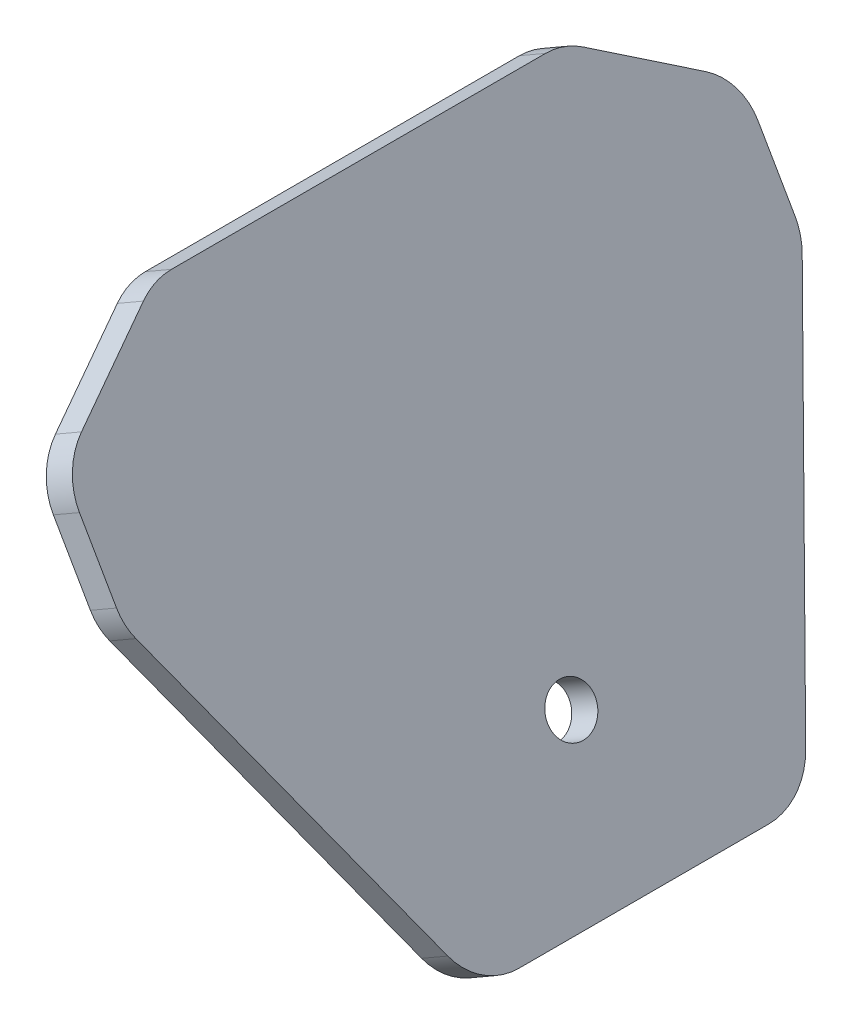
ISO-10303-21;
HEADER;
FILE_DESCRIPTION(('STEP AP214'),'2;1');
FILE_NAME('part.step','',(''),(''),'','','');
FILE_SCHEMA(('AUTOMOTIVE_DESIGN { 1 0 10303 214 1 1 1 1 }'));
ENDSEC;
DATA;
#1=APPLICATION_CONTEXT('core data for automotive mechanical design processes');
#2=APPLICATION_PROTOCOL_DEFINITION('international standard','automotive_design',2000,#1);
#3=PRODUCT_CONTEXT('',#1,'mechanical');
#4=PRODUCT('Part','Part','',(#3));
#5=PRODUCT_RELATED_PRODUCT_CATEGORY('part','',(#4));
#6=PRODUCT_DEFINITION_FORMATION('','',#4);
#7=PRODUCT_DEFINITION_CONTEXT('part definition',#1,'design');
#8=PRODUCT_DEFINITION('design','',#6,#7);
#9=PRODUCT_DEFINITION_SHAPE('','',#8);
#10=(LENGTH_UNIT() NAMED_UNIT(*) SI_UNIT(.MILLI.,.METRE.));
#11=(NAMED_UNIT(*) PLANE_ANGLE_UNIT() SI_UNIT($,.RADIAN.));
#12=(NAMED_UNIT(*) SI_UNIT($,.STERADIAN.) SOLID_ANGLE_UNIT());
#13=UNCERTAINTY_MEASURE_WITH_UNIT(LENGTH_MEASURE(1.E-05),#10,'distance_accuracy_value','');
#14=(GEOMETRIC_REPRESENTATION_CONTEXT(3) GLOBAL_UNCERTAINTY_ASSIGNED_CONTEXT((#13)) GLOBAL_UNIT_ASSIGNED_CONTEXT((#10,
#11,#12)) REPRESENTATION_CONTEXT('',''));
#15=CARTESIAN_POINT('',(0.,0.,0.));
#16=DIRECTION('',(0.,0.,1.));
#17=DIRECTION('',(1.,0.,0.));
#18=AXIS2_PLACEMENT_3D('',#15,#16,#17);
#19=CARTESIAN_POINT('',(350.423840178957,463.332240697996,748.20986492428));
#20=DIRECTION('',(0.418250232962619,-0.724430653768774,-0.54796621292454));
#21=DIRECTION('',(0.,0.603266543258945,-0.797539640258967));
#22=AXIS2_PLACEMENT_3D('',#19,#20,#21);
#23=PLANE('',#22);
#24=DIRECTION('',(0.273983106462267,-0.474552660808206,0.836500465925237));
#25=VECTOR('',#24,1.);
#26=CARTESIAN_POINT('',(350.423840178957,463.332240697996,748.20986492428));
#27=LINE('',#26,#25);
#28=CARTESIAN_POINT('',(350.942951199644,462.433114035396,749.794767790295));
#29=VERTEX_POINT('',#28);
#30=CARTESIAN_POINT('',(354.116130472235,456.937006313744,759.482832044551));
#31=VERTEX_POINT('',#30);
#32=EDGE_CURVE('E177',#29,#31,#27,.T.);
#33=ORIENTED_EDGE('',*,*,#32,.F.);
#34=DIRECTION('',(-0.866025403784439,-0.5,0.));
#35=VECTOR('',#34,1.);
#36=CARTESIAN_POINT('',(350.942951199644,462.433114035396,749.794767790295));
#37=LINE('',#36,#35);
#38=CARTESIAN_POINT('',(348.193320542628,460.845614035396,749.794767790295));
#39=VERTEX_POINT('',#38);
#40=EDGE_CURVE('E11',#29,#39,#37,.T.);
#41=ORIENTED_EDGE('',*,*,#40,.T.);
#42=DIRECTION('',(0.273983106462267,-0.474552660808206,0.836500465925237));
#43=VECTOR('',#42,1.);
#44=CARTESIAN_POINT('',(347.674209521941,461.744740697996,748.20986492428));
#45=LINE('',#44,#43);
#46=CARTESIAN_POINT('',(351.36649981522,455.349506313744,759.482832044551));
#47=VERTEX_POINT('',#46);
#48=EDGE_CURVE('E246',#39,#47,#45,.T.);
#49=ORIENTED_EDGE('',*,*,#48,.T.);
#50=DIRECTION('',(-0.866025403784439,-0.5,0.));
#51=VECTOR('',#50,1.);
#52=CARTESIAN_POINT('',(354.116130472235,456.937006313744,759.482832044551));
#53=LINE('',#52,#51);
#54=EDGE_CURVE('E43',#47,#31,#53,.F.);
#55=ORIENTED_EDGE('',*,*,#54,.T.);
#56=EDGE_LOOP('',(#33,#41,#49,#55));
#57=FACE_BOUND('',#56,.T.);
#58=ADVANCED_FACE('F34',(#57),#23,.F.);
#59=CARTESIAN_POINT('',(355.056291448483,455.308599735589,762.35324659248));
#60=DIRECTION('',(0.,0.,-1.));
#61=DIRECTION('',(-1.,0.,0.));
#62=AXIS2_PLACEMENT_3D('',#59,#60,#61);
#63=PLANE('',#62);
#64=DIRECTION('',(0.500000000000002,-0.866025403784437,0.));
#65=VECTOR('',#64,1.);
#66=CARTESIAN_POINT('',(352.306660791468,453.721099735589,762.35324659248));
#67=LINE('',#66,#65);
#68=CARTESIAN_POINT('',(354.022388794532,450.749371662312,762.35324659248));
#69=VERTEX_POINT('',#68);
#70=CARTESIAN_POINT('',(357.922056017686,443.994949899199,762.35324659248));
#71=VERTEX_POINT('',#70);
#72=EDGE_CURVE('E259',#69,#71,#67,.T.);
#73=ORIENTED_EDGE('',*,*,#72,.T.);
#74=DIRECTION('',(-0.866025403784439,-0.5,0.));
#75=VECTOR('',#74,1.);
#76=CARTESIAN_POINT('',(360.671686674702,445.582449899199,762.35324659248));
#77=LINE('',#76,#75);
#78=CARTESIAN_POINT('',(360.671686674702,445.582449899199,762.35324659248));
#79=VERTEX_POINT('',#78);
#80=EDGE_CURVE('E239',#71,#79,#77,.F.);
#81=ORIENTED_EDGE('',*,*,#80,.T.);
#82=DIRECTION('',(0.500000000000002,-0.866025403784437,0.));
#83=VECTOR('',#82,1.);
#84=CARTESIAN_POINT('',(355.056291448483,455.308599735589,762.35324659248));
#85=LINE('',#84,#83);
#86=CARTESIAN_POINT('',(356.772019451548,452.336871662312,762.35324659248));
#87=VERTEX_POINT('',#86);
#88=EDGE_CURVE('E181',#87,#79,#85,.T.);
#89=ORIENTED_EDGE('',*,*,#88,.F.);
#90=DIRECTION('',(-0.866025403784439,-0.5,0.));
#91=VECTOR('',#90,1.);
#92=CARTESIAN_POINT('',(356.772019451548,452.336871662312,762.35324659248));
#93=LINE('',#92,#91);
#94=EDGE_CURVE('E236',#87,#69,#93,.T.);
#95=ORIENTED_EDGE('',*,*,#94,.T.);
#96=EDGE_LOOP('',(#73,#81,#89,#95));
#97=FACE_BOUND('',#96,.T.);
#98=ADVANCED_FACE('F258',(#97),#63,.F.);
#99=CARTESIAN_POINT('',(361.406291448483,444.310077107526,762.35324659248));
#100=DIRECTION('',(-0.219614975724039,0.380384296057043,-0.898374671142791));
#101=DIRECTION('',(0.,0.920855871051939,0.389903147908778));
#102=AXIS2_PLACEMENT_3D('',#99,#100,#101);
#103=PLANE('',#102);
#104=DIRECTION('',(0.449187335571395,-0.778015287326147,-0.43922995144808));
#105=VECTOR('',#104,1.);
#106=CARTESIAN_POINT('',(358.656660791468,442.722577107526,762.35324659248));
#107=LINE('',#106,#105);
#108=CARTESIAN_POINT('',(359.316611113534,441.579509619237,761.707925754237));
#109=VERTEX_POINT('',#108);
#110=CARTESIAN_POINT('',(375.926215887315,412.810830257408,745.466515276625));
#111=VERTEX_POINT('',#110);
#112=EDGE_CURVE('E262',#109,#111,#107,.T.);
#113=ORIENTED_EDGE('',*,*,#112,.T.);
#114=DIRECTION('',(-0.866025403784439,-0.5,0.));
#115=VECTOR('',#114,1.);
#116=CARTESIAN_POINT('',(378.675846544331,414.398330257408,745.466515276625));
#117=LINE('',#116,#115);
#118=CARTESIAN_POINT('',(378.675846544331,414.398330257408,745.466515276625));
#119=VERTEX_POINT('',#118);
#120=EDGE_CURVE('E234',#111,#119,#117,.F.);
#121=ORIENTED_EDGE('',*,*,#120,.T.);
#122=DIRECTION('',(0.449187335571395,-0.778015287326147,-0.43922995144808));
#123=VECTOR('',#122,1.);
#124=CARTESIAN_POINT('',(361.406291448483,444.310077107526,762.35324659248));
#125=LINE('',#124,#123);
#126=CARTESIAN_POINT('',(362.066241770549,443.167009619237,761.707925754237));
#127=VERTEX_POINT('',#126);
#128=EDGE_CURVE('E294',#127,#119,#125,.T.);
#129=ORIENTED_EDGE('',*,*,#128,.F.);
#130=DIRECTION('',(-0.866025403784439,-0.5,0.));
#131=VECTOR('',#130,1.);
#132=CARTESIAN_POINT('',(362.066241770549,443.167009619237,761.707925754237));
#133=LINE('',#132,#131);
#134=EDGE_CURVE('E231',#127,#109,#133,.T.);
#135=ORIENTED_EDGE('',*,*,#134,.T.);
#136=EDGE_LOOP('',(#113,#121,#129,#135));
#137=FACE_BOUND('',#136,.T.);
#138=ADVANCED_FACE('F319',(#137),#103,.F.);
#139=CARTESIAN_POINT('',(380.456291448483,411.314509223339,709.514191369092));
#140=DIRECTION('',(-0.5,0.866025403784439,0.));
#141=DIRECTION('',(-0.866025403784439,-0.5,0.));
#142=AXIS2_PLACEMENT_3D('',#139,#140,#141);
#143=PLANE('',#142);
#144=DIRECTION('',(0.,0.,-1.));
#145=VECTOR('',#144,1.);
#146=CARTESIAN_POINT('',(377.706660791468,409.72700922334,709.514191369092));
#147=LINE('',#146,#145);
#148=CARTESIAN_POINT('',(377.706660791468,409.727009223339,739.761836114868));
#149=VERTEX_POINT('',#148);
#150=CARTESIAN_POINT('',(377.706660791468,409.72700922334,713.477893733691));
#151=VERTEX_POINT('',#150);
#152=EDGE_CURVE('E265',#149,#151,#147,.T.);
#153=ORIENTED_EDGE('',*,*,#152,.T.);
#154=DIRECTION('',(-0.866025403784439,-0.5,0.));
#155=VECTOR('',#154,1.);
#156=CARTESIAN_POINT('',(380.456291448483,411.314509223339,713.477893733691));
#157=LINE('',#156,#155);
#158=CARTESIAN_POINT('',(380.456291448483,411.314509223339,713.477893733691));
#159=VERTEX_POINT('',#158);
#160=EDGE_CURVE('E229',#151,#159,#157,.F.);
#161=ORIENTED_EDGE('',*,*,#160,.T.);
#162=DIRECTION('',(0.,0.,-1.));
#163=VECTOR('',#162,1.);
#164=CARTESIAN_POINT('',(380.456291448483,411.314509223339,709.514191369092));
#165=LINE('',#164,#163);
#166=CARTESIAN_POINT('',(380.456291448483,411.314509223339,739.761836114868));
#167=VERTEX_POINT('',#166);
#168=EDGE_CURVE('E291',#167,#159,#165,.T.);
#169=ORIENTED_EDGE('',*,*,#168,.F.);
#170=DIRECTION('',(-0.866025403784439,-0.5,0.));
#171=VECTOR('',#170,1.);
#172=CARTESIAN_POINT('',(380.456291448483,411.314509223339,739.761836114868));
#173=LINE('',#172,#171);
#174=EDGE_CURVE('E226',#167,#149,#173,.T.);
#175=ORIENTED_EDGE('',*,*,#174,.T.);
#176=EDGE_LOOP('',(#153,#161,#169,#175));
#177=FACE_BOUND('',#176,.T.);
#178=ADVANCED_FACE('F442',(#177),#143,.F.);
#179=CARTESIAN_POINT('',(361.406291448483,444.310077107527,690.886483256079));
#180=DIRECTION('',(-0.219614975724035,0.380384296057033,0.898374671142796));
#181=DIRECTION('',(0.,-0.920855871051944,0.389903147908767));
#182=AXIS2_PLACEMENT_3D('',#179,#180,#181);
#183=PLANE('',#182);
#184=DIRECTION('',(-0.449187335571399,0.778015287326152,-0.439229951448069));
#185=VECTOR('',#184,1.);
#186=CARTESIAN_POINT('',(358.656660791468,442.722577107527,690.886483256079));
#187=LINE('',#186,#185);
#188=CARTESIAN_POINT('',(375.926215887315,412.810830257408,707.773214571934));
#189=VERTEX_POINT('',#188);
#190=CARTESIAN_POINT('',(359.316611113534,441.579509619237,691.531804094323));
#191=VERTEX_POINT('',#190);
#192=EDGE_CURVE('E272',#189,#191,#187,.T.);
#193=ORIENTED_EDGE('',*,*,#192,.T.);
#194=DIRECTION('',(-0.866025403784439,-0.5,0.));
#195=VECTOR('',#194,1.);
#196=CARTESIAN_POINT('',(362.066241770549,443.167009619237,691.531804094323));
#197=LINE('',#196,#195);
#198=CARTESIAN_POINT('',(362.066241770549,443.167009619237,691.531804094323));
#199=VERTEX_POINT('',#198);
#200=EDGE_CURVE('E224',#191,#199,#197,.F.);
#201=ORIENTED_EDGE('',*,*,#200,.T.);
#202=DIRECTION('',(-0.449187335571399,0.778015287326152,-0.439229951448069));
#203=VECTOR('',#202,1.);
#204=CARTESIAN_POINT('',(361.406291448483,444.310077107527,690.886483256079));
#205=LINE('',#204,#203);
#206=CARTESIAN_POINT('',(378.675846544331,414.398330257408,707.773214571934));
#207=VERTEX_POINT('',#206);
#208=EDGE_CURVE('E287',#207,#199,#205,.T.);
#209=ORIENTED_EDGE('',*,*,#208,.F.);
#210=DIRECTION('',(-0.866025403784439,-0.5,0.));
#211=VECTOR('',#210,1.);
#212=CARTESIAN_POINT('',(378.675846544331,414.398330257408,707.773214571934));
#213=LINE('',#212,#211);
#214=EDGE_CURVE('E221',#207,#189,#213,.T.);
#215=ORIENTED_EDGE('',*,*,#214,.T.);
#216=EDGE_LOOP('',(#193,#201,#209,#215));
#217=FACE_BOUND('',#216,.T.);
#218=ADVANCED_FACE('F433',(#217),#183,.F.);
#219=CARTESIAN_POINT('',(355.056291448483,455.308599735589,690.886483256079));
#220=DIRECTION('',(0.,0.,1.));
#221=DIRECTION('',(1.,0.,0.));
#222=AXIS2_PLACEMENT_3D('',#219,#220,#221);
#223=PLANE('',#222);
#224=DIRECTION('',(-0.499999999999997,0.86602540378444,0.));
#225=VECTOR('',#224,1.);
#226=CARTESIAN_POINT('',(352.306660791468,453.721099735589,690.886483256079));
#227=LINE('',#226,#225);
#228=CARTESIAN_POINT('',(357.922056017686,443.994949899199,690.886483256079));
#229=VERTEX_POINT('',#228);
#230=CARTESIAN_POINT('',(354.022388794532,450.749371662312,690.886483256079));
#231=VERTEX_POINT('',#230);
#232=EDGE_CURVE('E183',#229,#231,#227,.T.);
#233=ORIENTED_EDGE('',*,*,#232,.T.);
#234=DIRECTION('',(-0.866025403784439,-0.5,0.));
#235=VECTOR('',#234,1.);
#236=CARTESIAN_POINT('',(356.772019451548,452.336871662312,690.886483256079));
#237=LINE('',#236,#235);
#238=CARTESIAN_POINT('',(356.772019451548,452.336871662312,690.886483256079));
#239=VERTEX_POINT('',#238);
#240=EDGE_CURVE('E50',#231,#239,#237,.F.);
#241=ORIENTED_EDGE('',*,*,#240,.T.);
#242=DIRECTION('',(-0.499999999999997,0.86602540378444,0.));
#243=VECTOR('',#242,1.);
#244=CARTESIAN_POINT('',(355.056291448483,455.308599735589,690.886483256079));
#245=LINE('',#244,#243);
#246=CARTESIAN_POINT('',(360.671686674702,445.582449899199,690.886483256079));
#247=VERTEX_POINT('',#246);
#248=EDGE_CURVE('E283',#247,#239,#245,.T.);
#249=ORIENTED_EDGE('',*,*,#248,.F.);
#250=DIRECTION('',(-0.866025403784439,-0.5,0.));
#251=VECTOR('',#250,1.);
#252=CARTESIAN_POINT('',(360.671686674702,445.582449899199,690.886483256079));
#253=LINE('',#252,#251);
#254=EDGE_CURVE('E217',#247,#229,#253,.T.);
#255=ORIENTED_EDGE('',*,*,#254,.T.);
#256=EDGE_LOOP('',(#233,#241,#249,#255));
#257=FACE_BOUND('',#256,.T.);
#258=ADVANCED_FACE('F275',(#257),#223,.F.);
#259=CARTESIAN_POINT('',(350.423840178957,463.332240697996,705.02986492428));
#260=DIRECTION('',(0.41825023296262,-0.724430653768779,0.547966212924532));
#261=DIRECTION('',(0.,-0.603266543258937,-0.797539640258974));
#262=AXIS2_PLACEMENT_3D('',#259,#260,#261);
#263=PLANE('',#262);
#264=DIRECTION('',(-0.273983106462268,0.474552660808196,0.836500465925242));
#265=VECTOR('',#264,1.);
#266=CARTESIAN_POINT('',(347.674209521941,461.744740697996,705.02986492428));
#267=LINE('',#266,#265);
#268=CARTESIAN_POINT('',(351.36649981522,455.349506313744,693.756897804009));
#269=VERTEX_POINT('',#268);
#270=CARTESIAN_POINT('',(348.193320542628,460.845614035396,703.444962058264));
#271=VERTEX_POINT('',#270);
#272=EDGE_CURVE('E178',#269,#271,#267,.T.);
#273=ORIENTED_EDGE('',*,*,#272,.T.);
#274=DIRECTION('',(-0.866025403784439,-0.5,0.));
#275=VECTOR('',#274,1.);
#276=CARTESIAN_POINT('',(350.942951199644,462.433114035396,703.444962058264));
#277=LINE('',#276,#275);
#278=CARTESIAN_POINT('',(350.942951199644,462.433114035396,703.444962058264));
#279=VERTEX_POINT('',#278);
#280=EDGE_CURVE('E155',#271,#279,#277,.F.);
#281=ORIENTED_EDGE('',*,*,#280,.T.);
#282=DIRECTION('',(-0.273983106462268,0.474552660808196,0.836500465925242));
#283=VECTOR('',#282,1.);
#284=CARTESIAN_POINT('',(350.423840178957,463.332240697996,705.02986492428));
#285=LINE('',#284,#283);
#286=CARTESIAN_POINT('',(354.116130472235,456.937006313744,693.756897804009));
#287=VERTEX_POINT('',#286);
#288=EDGE_CURVE('E282',#287,#279,#285,.T.);
#289=ORIENTED_EDGE('',*,*,#288,.F.);
#290=DIRECTION('',(-0.866025403784439,-0.5,0.));
#291=VECTOR('',#290,1.);
#292=CARTESIAN_POINT('',(354.116130472235,456.937006313744,693.756897804009));
#293=LINE('',#292,#291);
#294=EDGE_CURVE('E160',#287,#269,#293,.T.);
#295=ORIENTED_EDGE('',*,*,#294,.T.);
#296=EDGE_LOOP('',(#273,#281,#289,#295));
#297=FACE_BOUND('',#296,.T.);
#298=ADVANCED_FACE('F285',(#297),#263,.F.);
#299=CARTESIAN_POINT('',(350.423840178957,463.332240697996,748.20986492428));
#300=DIRECTION('',(0.5,-0.866025403784439,0.));
#301=DIRECTION('',(0.866025403784439,0.5,0.));
#302=AXIS2_PLACEMENT_3D('',#299,#300,#301);
#303=PLANE('',#302);
#304=DIRECTION('',(0.,0.,1.));
#305=VECTOR('',#304,1.);
#306=CARTESIAN_POINT('',(350.423840178957,463.332240697996,748.20986492428));
#307=LINE('',#306,#305);
#308=CARTESIAN_POINT('',(350.423840178957,463.332240697996,706.924547510335));
#309=VERTEX_POINT('',#308);
#310=CARTESIAN_POINT('',(350.423840178957,463.332240697996,746.315182338224));
#311=VERTEX_POINT('',#310);
#312=EDGE_CURVE('E170',#309,#311,#307,.T.);
#313=ORIENTED_EDGE('',*,*,#312,.F.);
#314=DIRECTION('',(-0.866025403784439,-0.5,0.));
#315=VECTOR('',#314,1.);
#316=CARTESIAN_POINT('',(350.423840178957,463.332240697996,706.924547510335));
#317=LINE('',#316,#315);
#318=CARTESIAN_POINT('',(347.674209521941,461.744740697996,706.924547510335));
#319=VERTEX_POINT('',#318);
#320=EDGE_CURVE('E154',#309,#319,#317,.T.);
#321=ORIENTED_EDGE('',*,*,#320,.T.);
#322=DIRECTION('',(0.,0.,1.));
#323=VECTOR('',#322,1.);
#324=CARTESIAN_POINT('',(347.674209521941,461.744740697996,748.20986492428));
#325=LINE('',#324,#323);
#326=CARTESIAN_POINT('',(347.674209521941,461.744740697996,746.315182338224));
#327=VERTEX_POINT('',#326);
#328=EDGE_CURVE('E167',#319,#327,#325,.T.);
#329=ORIENTED_EDGE('',*,*,#328,.T.);
#330=DIRECTION('',(-0.866025403784439,-0.5,0.));
#331=VECTOR('',#330,1.);
#332=CARTESIAN_POINT('',(350.423840178957,463.332240697996,746.315182338224));
#333=LINE('',#332,#331);
#334=EDGE_CURVE('E172',#327,#311,#333,.F.);
#335=ORIENTED_EDGE('',*,*,#334,.T.);
#336=EDGE_LOOP('',(#313,#321,#329,#335));
#337=FACE_BOUND('',#336,.T.);
#338=ADVANCED_FACE('F166',(#337),#303,.F.);
#339=CARTESIAN_POINT('',(463.446625552635,267.571034017837,1.79007072823848E-12));
#340=DIRECTION('',(0.866025403784439,0.499999999999999,0.));
#341=DIRECTION('',(-0.499999999999999,0.866025403784439,0.));
#342=AXIS2_PLACEMENT_3D('',#339,#340,#341);
#343=PLANE('',#342);
#344=CARTESIAN_POINT('',(372.836291448483,424.512736377014,726.619864924279));
#345=DIRECTION('',(0.866025403784439,0.499999999999999,0.));
#346=DIRECTION('',(-0.499999999999999,0.866025403784439,0.));
#347=AXIS2_PLACEMENT_3D('',#344,#345,#346);
#348=CIRCLE('',#347,2.4999999999999);
#349=CARTESIAN_POINT('',(371.586291448483,426.677799886475,726.619864924279));
#350=VERTEX_POINT('',#349);
#351=EDGE_CURVE('E298',#350,#350,#348,.T.);
#352=ORIENTED_EDGE('',*,*,#351,.F.);
#353=EDGE_LOOP('',(#352));
#354=FACE_BOUND('',#353,.T.);
#355=ORIENTED_EDGE('',*,*,#288,.T.);
#356=CARTESIAN_POINT('',(353.598840178957,457.832979383965,706.924547510335));
#357=DIRECTION('',(0.866025403784439,0.499999999999999,0.));
#358=DIRECTION('',(-0.499999999999999,0.866025403784439,0.));
#359=AXIS2_PLACEMENT_3D('',#356,#357,#358);
#360=CIRCLE('',#359,6.35);
#361=EDGE_CURVE('E215',#279,#309,#360,.T.);
#362=ORIENTED_EDGE('',*,*,#361,.T.);
#363=ORIENTED_EDGE('',*,*,#312,.T.);
#364=CARTESIAN_POINT('',(353.598840178957,457.832979383965,746.315182338224));
#365=DIRECTION('',(0.866025403784439,0.499999999999999,0.));
#366=DIRECTION('',(-0.499999999999999,0.866025403784439,0.));
#367=AXIS2_PLACEMENT_3D('',#364,#365,#366);
#368=CIRCLE('',#367,6.35);
#369=EDGE_CURVE('E204',#311,#29,#368,.T.);
#370=ORIENTED_EDGE('',*,*,#369,.T.);
#371=ORIENTED_EDGE('',*,*,#32,.T.);
#372=CARTESIAN_POINT('',(356.772019451548,452.336871662312,756.00324659248));
#373=DIRECTION('',(0.866025403784439,0.499999999999999,0.));
#374=DIRECTION('',(-0.499999999999999,0.866025403784439,0.));
#375=AXIS2_PLACEMENT_3D('',#372,#373,#374);
#376=CIRCLE('',#375,6.35);
#377=EDGE_CURVE('E202',#31,#87,#376,.T.);
#378=ORIENTED_EDGE('',*,*,#377,.T.);
#379=ORIENTED_EDGE('',*,*,#88,.T.);
#380=CARTESIAN_POINT('',(360.671686674702,445.582449899199,756.00324659248));
#381=DIRECTION('',(0.866025403784439,0.499999999999999,0.));
#382=DIRECTION('',(-0.499999999999999,0.866025403784439,0.));
#383=AXIS2_PLACEMENT_3D('',#380,#381,#382);
#384=CIRCLE('',#383,6.35);
#385=EDGE_CURVE('E206',#79,#127,#384,.T.);
#386=ORIENTED_EDGE('',*,*,#385,.T.);
#387=ORIENTED_EDGE('',*,*,#128,.T.);
#388=CARTESIAN_POINT('',(377.281291448483,416.813770537371,739.761836114868));
#389=DIRECTION('',(0.866025403784439,0.499999999999999,0.));
#390=DIRECTION('',(-0.499999999999999,0.866025403784439,0.));
#391=AXIS2_PLACEMENT_3D('',#388,#389,#390);
#392=CIRCLE('',#391,6.35);
#393=EDGE_CURVE('E208',#119,#167,#392,.T.);
#394=ORIENTED_EDGE('',*,*,#393,.T.);
#395=ORIENTED_EDGE('',*,*,#168,.T.);
#396=CARTESIAN_POINT('',(377.281291448483,416.813770537371,713.477893733691));
#397=DIRECTION('',(0.866025403784439,0.499999999999999,0.));
#398=DIRECTION('',(-0.499999999999999,0.866025403784439,0.));
#399=AXIS2_PLACEMENT_3D('',#396,#397,#398);
#400=CIRCLE('',#399,6.35);
#401=EDGE_CURVE('E210',#159,#207,#400,.T.);
#402=ORIENTED_EDGE('',*,*,#401,.T.);
#403=ORIENTED_EDGE('',*,*,#208,.T.);
#404=CARTESIAN_POINT('',(360.671686674702,445.582449899199,697.23648325608));
#405=DIRECTION('',(0.866025403784439,0.499999999999999,0.));
#406=DIRECTION('',(-0.499999999999999,0.866025403784439,0.));
#407=AXIS2_PLACEMENT_3D('',#404,#405,#406);
#408=CIRCLE('',#407,6.35);
#409=EDGE_CURVE('E57',#199,#247,#408,.T.);
#410=ORIENTED_EDGE('',*,*,#409,.T.);
#411=ORIENTED_EDGE('',*,*,#248,.T.);
#412=CARTESIAN_POINT('',(356.772019451548,452.336871662312,697.23648325608));
#413=DIRECTION('',(0.866025403784439,0.499999999999999,0.));
#414=DIRECTION('',(-0.499999999999999,0.866025403784439,0.));
#415=AXIS2_PLACEMENT_3D('',#412,#413,#414);
#416=CIRCLE('',#415,6.35);
#417=EDGE_CURVE('E213',#239,#287,#416,.T.);
#418=ORIENTED_EDGE('',*,*,#417,.T.);
#419=EDGE_LOOP('',(#355,#362,#363,#370,#371,#378,#379,#386,#387,#394,#395,#402,#403,#410,#411,#418));
#420=FACE_BOUND('',#419,.T.);
#421=ADVANCED_FACE('F250',(#354,#420),#343,.T.);
#422=CARTESIAN_POINT('',(460.696994895619,265.983534017837,1.78578178276468E-12));
#423=DIRECTION('',(0.866025403784439,0.499999999999999,0.));
#424=DIRECTION('',(-0.499999999999999,0.866025403784439,0.));
#425=AXIS2_PLACEMENT_3D('',#422,#423,#424);
#426=PLANE('',#425);
#427=CARTESIAN_POINT('',(370.086660791468,422.925236377014,726.619864924279));
#428=DIRECTION('',(0.866025403784439,0.499999999999999,0.));
#429=DIRECTION('',(-0.499999999999999,0.866025403784439,0.));
#430=AXIS2_PLACEMENT_3D('',#427,#428,#429);
#431=CIRCLE('',#430,2.4999999999999);
#432=CARTESIAN_POINT('',(368.836660791468,425.090299886475,726.619864924279));
#433=VERTEX_POINT('',#432);
#434=EDGE_CURVE('E38',#433,#433,#431,.T.);
#435=ORIENTED_EDGE('',*,*,#434,.T.);
#436=EDGE_LOOP('',(#435));
#437=FACE_BOUND('',#436,.T.);
#438=ORIENTED_EDGE('',*,*,#328,.F.);
#439=CARTESIAN_POINT('',(350.849209521941,456.245479383965,706.924547510335));
#440=DIRECTION('',(0.866025403784439,0.499999999999999,0.));
#441=DIRECTION('',(-0.499999999999999,0.866025403784439,0.));
#442=AXIS2_PLACEMENT_3D('',#439,#440,#441);
#443=CIRCLE('',#442,6.35);
#444=EDGE_CURVE('E150',#319,#271,#443,.F.);
#445=ORIENTED_EDGE('',*,*,#444,.T.);
#446=ORIENTED_EDGE('',*,*,#272,.F.);
#447=CARTESIAN_POINT('',(354.022388794532,450.749371662312,697.23648325608));
#448=DIRECTION('',(0.866025403784439,0.499999999999999,0.));
#449=DIRECTION('',(-0.499999999999999,0.866025403784439,0.));
#450=AXIS2_PLACEMENT_3D('',#447,#448,#449);
#451=CIRCLE('',#450,6.35);
#452=EDGE_CURVE('E161',#269,#231,#451,.F.);
#453=ORIENTED_EDGE('',*,*,#452,.T.);
#454=ORIENTED_EDGE('',*,*,#232,.F.);
#455=CARTESIAN_POINT('',(357.922056017686,443.994949899199,697.23648325608));
#456=DIRECTION('',(0.866025403784439,0.499999999999999,0.));
#457=DIRECTION('',(-0.499999999999999,0.866025403784439,0.));
#458=AXIS2_PLACEMENT_3D('',#455,#456,#457);
#459=CIRCLE('',#458,6.35);
#460=EDGE_CURVE('E196',#229,#191,#459,.F.);
#461=ORIENTED_EDGE('',*,*,#460,.T.);
#462=ORIENTED_EDGE('',*,*,#192,.F.);
#463=CARTESIAN_POINT('',(374.531660791468,415.226270537371,713.477893733691));
#464=DIRECTION('',(0.866025403784439,0.499999999999999,0.));
#465=DIRECTION('',(-0.499999999999999,0.866025403784439,0.));
#466=AXIS2_PLACEMENT_3D('',#463,#464,#465);
#467=CIRCLE('',#466,6.35);
#468=EDGE_CURVE('E194',#189,#151,#467,.F.);
#469=ORIENTED_EDGE('',*,*,#468,.T.);
#470=ORIENTED_EDGE('',*,*,#152,.F.);
#471=CARTESIAN_POINT('',(374.531660791468,415.226270537371,739.761836114868));
#472=DIRECTION('',(0.866025403784439,0.499999999999999,0.));
#473=DIRECTION('',(-0.499999999999999,0.866025403784439,0.));
#474=AXIS2_PLACEMENT_3D('',#471,#472,#473);
#475=CIRCLE('',#474,6.35);
#476=EDGE_CURVE('E192',#149,#111,#475,.F.);
#477=ORIENTED_EDGE('',*,*,#476,.T.);
#478=ORIENTED_EDGE('',*,*,#112,.F.);
#479=CARTESIAN_POINT('',(357.922056017686,443.994949899199,756.00324659248));
#480=DIRECTION('',(0.866025403784439,0.499999999999999,0.));
#481=DIRECTION('',(-0.499999999999999,0.866025403784439,0.));
#482=AXIS2_PLACEMENT_3D('',#479,#480,#481);
#483=CIRCLE('',#482,6.35);
#484=EDGE_CURVE('E190',#109,#71,#483,.F.);
#485=ORIENTED_EDGE('',*,*,#484,.T.);
#486=ORIENTED_EDGE('',*,*,#72,.F.);
#487=CARTESIAN_POINT('',(354.022388794532,450.749371662312,756.00324659248));
#488=DIRECTION('',(0.866025403784439,0.499999999999999,0.));
#489=DIRECTION('',(-0.499999999999999,0.866025403784439,0.));
#490=AXIS2_PLACEMENT_3D('',#487,#488,#489);
#491=CIRCLE('',#490,6.35);
#492=EDGE_CURVE('E171',#69,#47,#491,.F.);
#493=ORIENTED_EDGE('',*,*,#492,.T.);
#494=ORIENTED_EDGE('',*,*,#48,.F.);
#495=CARTESIAN_POINT('',(350.849209521941,456.245479383965,746.315182338224));
#496=DIRECTION('',(0.866025403784439,0.499999999999999,0.));
#497=DIRECTION('',(-0.499999999999999,0.866025403784439,0.));
#498=AXIS2_PLACEMENT_3D('',#495,#496,#497);
#499=CIRCLE('',#498,6.35);
#500=EDGE_CURVE('E176',#39,#327,#499,.F.);
#501=ORIENTED_EDGE('',*,*,#500,.T.);
#502=EDGE_LOOP('',(#438,#445,#446,#453,#454,#461,#462,#469,#470,#477,#478,#485,#486,#493,#494,#501));
#503=FACE_BOUND('',#502,.T.);
#504=ADVANCED_FACE('F174',(#437,#503),#426,.F.);
#505=CARTESIAN_POINT('',(353.598840178957,457.832979383965,706.924547510335));
#506=DIRECTION('',(-0.866025403784439,-0.5,0.));
#507=DIRECTION('',(0.5,-0.866025403784439,0.));
#508=AXIS2_PLACEMENT_3D('',#505,#506,#507);
#509=CYLINDRICAL_SURFACE('',#508,6.35);
#510=ORIENTED_EDGE('',*,*,#361,.F.);
#511=ORIENTED_EDGE('',*,*,#280,.F.);
#512=ORIENTED_EDGE('',*,*,#444,.F.);
#513=ORIENTED_EDGE('',*,*,#320,.F.);
#514=EDGE_LOOP('',(#510,#511,#512,#513));
#515=FACE_BOUND('',#514,.T.);
#516=ADVANCED_FACE('F153',(#515),#509,.T.);
#517=CARTESIAN_POINT('',(356.772019451548,452.336871662312,697.23648325608));
#518=DIRECTION('',(-0.866025403784439,-0.5,0.));
#519=DIRECTION('',(0.5,-0.866025403784439,0.));
#520=AXIS2_PLACEMENT_3D('',#517,#518,#519);
#521=CYLINDRICAL_SURFACE('',#520,6.35);
#522=ORIENTED_EDGE('',*,*,#417,.F.);
#523=ORIENTED_EDGE('',*,*,#240,.F.);
#524=ORIENTED_EDGE('',*,*,#452,.F.);
#525=ORIENTED_EDGE('',*,*,#294,.F.);
#526=EDGE_LOOP('',(#522,#523,#524,#525));
#527=FACE_BOUND('',#526,.T.);
#528=ADVANCED_FACE('F279',(#527),#521,.T.);
#529=CARTESIAN_POINT('',(360.671686674702,445.582449899199,697.23648325608));
#530=DIRECTION('',(-0.866025403784439,-0.5,0.));
#531=DIRECTION('',(0.5,-0.866025403784439,0.));
#532=AXIS2_PLACEMENT_3D('',#529,#530,#531);
#533=CYLINDRICAL_SURFACE('',#532,6.35);
#534=ORIENTED_EDGE('',*,*,#409,.F.);
#535=ORIENTED_EDGE('',*,*,#200,.F.);
#536=ORIENTED_EDGE('',*,*,#460,.F.);
#537=ORIENTED_EDGE('',*,*,#254,.F.);
#538=EDGE_LOOP('',(#534,#535,#536,#537));
#539=FACE_BOUND('',#538,.T.);
#540=ADVANCED_FACE('F327',(#539),#533,.T.);
#541=CARTESIAN_POINT('',(377.281291448483,416.813770537371,713.477893733691));
#542=DIRECTION('',(-0.866025403784439,-0.5,0.));
#543=DIRECTION('',(0.5,-0.866025403784439,0.));
#544=AXIS2_PLACEMENT_3D('',#541,#542,#543);
#545=CYLINDRICAL_SURFACE('',#544,6.35);
#546=ORIENTED_EDGE('',*,*,#401,.F.);
#547=ORIENTED_EDGE('',*,*,#160,.F.);
#548=ORIENTED_EDGE('',*,*,#468,.F.);
#549=ORIENTED_EDGE('',*,*,#214,.F.);
#550=EDGE_LOOP('',(#546,#547,#548,#549));
#551=FACE_BOUND('',#550,.T.);
#552=ADVANCED_FACE('F330',(#551),#545,.T.);
#553=CARTESIAN_POINT('',(377.281291448483,416.813770537371,739.761836114868));
#554=DIRECTION('',(-0.866025403784439,-0.5,0.));
#555=DIRECTION('',(0.5,-0.866025403784439,0.));
#556=AXIS2_PLACEMENT_3D('',#553,#554,#555);
#557=CYLINDRICAL_SURFACE('',#556,6.35);
#558=ORIENTED_EDGE('',*,*,#393,.F.);
#559=ORIENTED_EDGE('',*,*,#120,.F.);
#560=ORIENTED_EDGE('',*,*,#476,.F.);
#561=ORIENTED_EDGE('',*,*,#174,.F.);
#562=EDGE_LOOP('',(#558,#559,#560,#561));
#563=FACE_BOUND('',#562,.T.);
#564=ADVANCED_FACE('F334',(#563),#557,.T.);
#565=CARTESIAN_POINT('',(360.671686674702,445.582449899199,756.00324659248));
#566=DIRECTION('',(-0.866025403784439,-0.5,0.));
#567=DIRECTION('',(0.5,-0.866025403784439,0.));
#568=AXIS2_PLACEMENT_3D('',#565,#566,#567);
#569=CYLINDRICAL_SURFACE('',#568,6.35);
#570=ORIENTED_EDGE('',*,*,#385,.F.);
#571=ORIENTED_EDGE('',*,*,#80,.F.);
#572=ORIENTED_EDGE('',*,*,#484,.F.);
#573=ORIENTED_EDGE('',*,*,#134,.F.);
#574=EDGE_LOOP('',(#570,#571,#572,#573));
#575=FACE_BOUND('',#574,.T.);
#576=ADVANCED_FACE('F338',(#575),#569,.T.);
#577=CARTESIAN_POINT('',(353.598840178957,457.832979383965,746.315182338224));
#578=DIRECTION('',(-0.866025403784439,-0.5,0.));
#579=DIRECTION('',(0.5,-0.866025403784439,0.));
#580=AXIS2_PLACEMENT_3D('',#577,#578,#579);
#581=CYLINDRICAL_SURFACE('',#580,6.35);
#582=ORIENTED_EDGE('',*,*,#369,.F.);
#583=ORIENTED_EDGE('',*,*,#334,.F.);
#584=ORIENTED_EDGE('',*,*,#500,.F.);
#585=ORIENTED_EDGE('',*,*,#40,.F.);
#586=EDGE_LOOP('',(#582,#583,#584,#585));
#587=FACE_BOUND('',#586,.T.);
#588=ADVANCED_FACE('F312',(#587),#581,.T.);
#589=CARTESIAN_POINT('',(356.772019451548,452.336871662312,756.00324659248));
#590=DIRECTION('',(-0.866025403784439,-0.5,0.));
#591=DIRECTION('',(0.5,-0.866025403784439,0.));
#592=AXIS2_PLACEMENT_3D('',#589,#590,#591);
#593=CYLINDRICAL_SURFACE('',#592,6.35);
#594=ORIENTED_EDGE('',*,*,#377,.F.);
#595=ORIENTED_EDGE('',*,*,#54,.F.);
#596=ORIENTED_EDGE('',*,*,#492,.F.);
#597=ORIENTED_EDGE('',*,*,#94,.F.);
#598=EDGE_LOOP('',(#594,#595,#596,#597));
#599=FACE_BOUND('',#598,.T.);
#600=ADVANCED_FACE('F36',(#599),#593,.T.);
#601=CARTESIAN_POINT('',(362.277709725543,418.416736377015,726.619864924279));
#602=DIRECTION('',(0.866025403784439,0.499999999999999,0.));
#603=DIRECTION('',(-0.499999999999999,0.86602540378444,0.));
#604=AXIS2_PLACEMENT_3D('',#601,#602,#603);
#605=CYLINDRICAL_SURFACE('',#604,2.4999999999999);
#606=ORIENTED_EDGE('',*,*,#351,.T.);
#607=EDGE_LOOP('',(#606));
#608=FACE_BOUND('',#607,.T.);
#609=ORIENTED_EDGE('',*,*,#434,.F.);
#610=EDGE_LOOP('',(#609));
#611=FACE_BOUND('',#610,.T.);
#612=ADVANCED_FACE('F306',(#608,#611),#605,.F.);
#613=CLOSED_SHELL('',(#58,#98,#138,#178,#218,#258,#298,#338,#421,#504,#516,#528,#540,#552,#564,
#576,#588,#600,#612));
#614=MANIFOLD_SOLID_BREP('B2',#613);
#615=ADVANCED_BREP_SHAPE_REPRESENTATION('',(#18,#614),#14);
#616=SHAPE_DEFINITION_REPRESENTATION(#9,#615);
ENDSEC;
END-ISO-10303-21;
